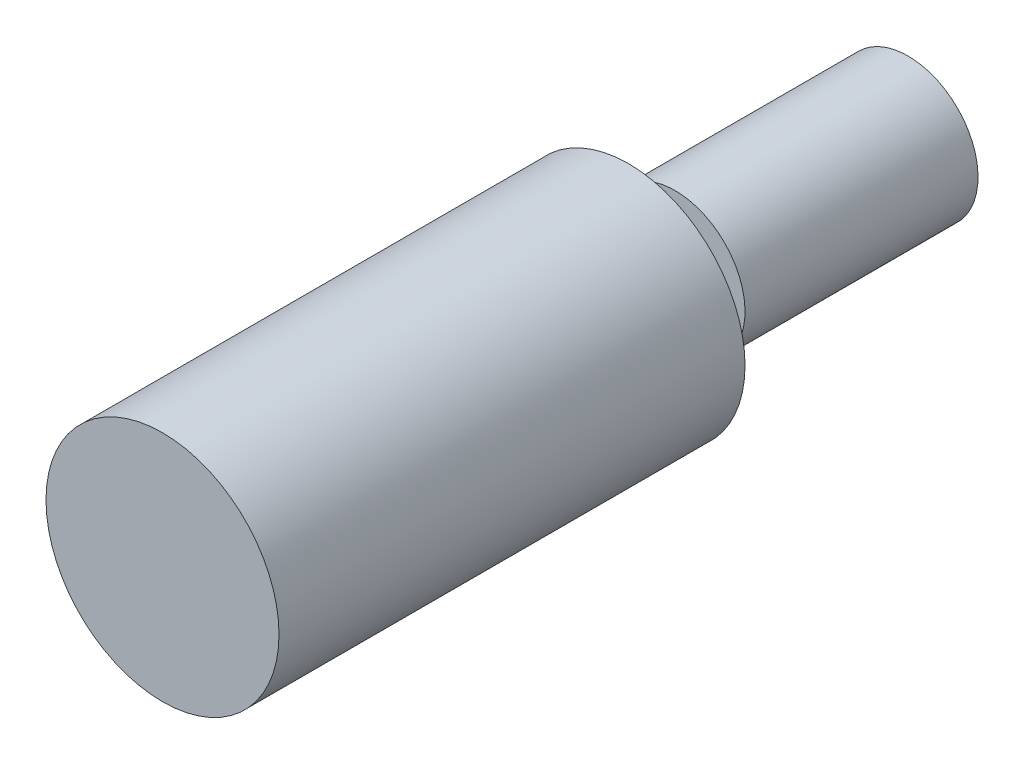
ISO-10303-21;
HEADER;
FILE_DESCRIPTION(('STEP AP214'),'2;1');
FILE_NAME('part.step','',(''),(''),'','','');
FILE_SCHEMA(('AUTOMOTIVE_DESIGN { 1 0 10303 214 1 1 1 1 }'));
ENDSEC;
DATA;
#1=APPLICATION_CONTEXT('core data for automotive mechanical design processes');
#2=APPLICATION_PROTOCOL_DEFINITION('international standard','automotive_design',2000,#1);
#3=PRODUCT_CONTEXT('',#1,'mechanical');
#4=PRODUCT('Part','Part','',(#3));
#5=PRODUCT_RELATED_PRODUCT_CATEGORY('part','',(#4));
#6=PRODUCT_DEFINITION_FORMATION('','',#4);
#7=PRODUCT_DEFINITION_CONTEXT('part definition',#1,'design');
#8=PRODUCT_DEFINITION('design','',#6,#7);
#9=PRODUCT_DEFINITION_SHAPE('','',#8);
#10=(LENGTH_UNIT() NAMED_UNIT(*) SI_UNIT(.MILLI.,.METRE.));
#11=(NAMED_UNIT(*) PLANE_ANGLE_UNIT() SI_UNIT($,.RADIAN.));
#12=(NAMED_UNIT(*) SI_UNIT($,.STERADIAN.) SOLID_ANGLE_UNIT());
#13=UNCERTAINTY_MEASURE_WITH_UNIT(LENGTH_MEASURE(1.E-05),#10,'distance_accuracy_value','');
#14=(GEOMETRIC_REPRESENTATION_CONTEXT(3) GLOBAL_UNCERTAINTY_ASSIGNED_CONTEXT((#13)) GLOBAL_UNIT_ASSIGNED_CONTEXT((#10,
#11,#12)) REPRESENTATION_CONTEXT('',''));
#15=CARTESIAN_POINT('',(0.,0.,0.));
#16=DIRECTION('',(0.,0.,1.));
#17=DIRECTION('',(1.,0.,0.));
#18=AXIS2_PLACEMENT_3D('',#15,#16,#17);
#19=CARTESIAN_POINT('',(0.,0.,-6.));
#20=DIRECTION('',(0.,0.,1.));
#21=DIRECTION('',(0.,-1.,0.));
#22=AXIS2_PLACEMENT_3D('',#19,#20,#21);
#23=PLANE('',#22);
#24=CARTESIAN_POINT('',(0.,0.,-6.));
#25=DIRECTION('',(0.,0.,1.));
#26=DIRECTION('',(0.,-1.,0.));
#27=AXIS2_PLACEMENT_3D('',#24,#25,#26);
#28=CIRCLE('',#27,1.50000000000001);
#29=CARTESIAN_POINT('',(0.,-1.50000000000005,-5.99999999999999));
#30=VERTEX_POINT('',#29);
#31=EDGE_CURVE('E10',#30,#30,#28,.T.);
#32=ORIENTED_EDGE('',*,*,#31,.F.);
#33=EDGE_LOOP('',(#32));
#34=FACE_BOUND('',#33,.T.);
#35=ADVANCED_FACE('F35',(#34),#23,.F.);
#36=CARTESIAN_POINT('',(0.,3.02086212207189E-13,44.6812413574794));
#37=DIRECTION('',(0.,0.,1.));
#38=DIRECTION('',(0.,-1.,0.));
#39=AXIS2_PLACEMENT_3D('',#36,#37,#38);
#40=CYLINDRICAL_SURFACE('',#39,1.5);
#41=CARTESIAN_POINT('',(0.,0.,-1.));
#42=DIRECTION('',(0.,0.,1.));
#43=DIRECTION('',(0.,-1.,0.));
#44=AXIS2_PLACEMENT_3D('',#41,#42,#43);
#45=CIRCLE('',#44,1.5);
#46=CARTESIAN_POINT('',(0.,-1.50000000000001,-0.999999999999991));
#47=VERTEX_POINT('',#46);
#48=EDGE_CURVE('E41',#47,#47,#45,.T.);
#49=ORIENTED_EDGE('',*,*,#48,.F.);
#50=EDGE_LOOP('',(#49));
#51=FACE_BOUND('',#50,.T.);
#52=ORIENTED_EDGE('',*,*,#31,.T.);
#53=EDGE_LOOP('',(#52));
#54=FACE_BOUND('',#53,.T.);
#55=ADVANCED_FACE('F83',(#51,#54),#40,.T.);
#56=CARTESIAN_POINT('',(1.5,0.,-1.));
#57=DIRECTION('',(0.,0.,-1.));
#58=DIRECTION('',(0.,1.,0.));
#59=AXIS2_PLACEMENT_3D('',#56,#57,#58);
#60=PLANE('',#59);
#61=CARTESIAN_POINT('',(0.,0.,-1.));
#62=DIRECTION('',(0.,0.,1.));
#63=DIRECTION('',(0.,-1.,0.));
#64=AXIS2_PLACEMENT_3D('',#61,#62,#63);
#65=CIRCLE('',#64,1.);
#66=CARTESIAN_POINT('',(0.,-1.00000000000001,-0.999999999999994));
#67=VERTEX_POINT('',#66);
#68=EDGE_CURVE('E45',#67,#67,#65,.T.);
#69=ORIENTED_EDGE('',*,*,#68,.F.);
#70=EDGE_LOOP('',(#69));
#71=FACE_BOUND('',#70,.T.);
#72=ORIENTED_EDGE('',*,*,#48,.T.);
#73=EDGE_LOOP('',(#72));
#74=FACE_BOUND('',#73,.T.);
#75=ADVANCED_FACE('F78',(#71,#74),#60,.F.);
#76=CARTESIAN_POINT('',(0.,3.02086212207189E-13,44.6812413574794));
#77=DIRECTION('',(0.,0.,1.));
#78=DIRECTION('',(0.,-1.,0.));
#79=AXIS2_PLACEMENT_3D('',#76,#77,#78);
#80=CYLINDRICAL_SURFACE('',#79,1.);
#81=CARTESIAN_POINT('',(0.,0.,0.));
#82=DIRECTION('',(0.,0.,1.));
#83=DIRECTION('',(0.,-1.,0.));
#84=AXIS2_PLACEMENT_3D('',#81,#82,#83);
#85=CIRCLE('',#84,1.);
#86=CARTESIAN_POINT('',(0.,-1.,0.));
#87=VERTEX_POINT('',#86);
#88=EDGE_CURVE('E49',#87,#87,#85,.T.);
#89=ORIENTED_EDGE('',*,*,#88,.F.);
#90=EDGE_LOOP('',(#89));
#91=FACE_BOUND('',#90,.T.);
#92=ORIENTED_EDGE('',*,*,#68,.T.);
#93=EDGE_LOOP('',(#92));
#94=FACE_BOUND('',#93,.T.);
#95=ADVANCED_FACE('F72',(#91,#94),#80,.T.);
#96=CARTESIAN_POINT('',(2.50000000000002,0.,0.));
#97=DIRECTION('',(0.,0.,1.));
#98=DIRECTION('',(0.,-1.,0.));
#99=AXIS2_PLACEMENT_3D('',#96,#97,#98);
#100=PLANE('',#99);
#101=CARTESIAN_POINT('',(0.,0.,0.));
#102=DIRECTION('',(0.,0.,1.));
#103=DIRECTION('',(0.,-1.,0.));
#104=AXIS2_PLACEMENT_3D('',#101,#102,#103);
#105=CIRCLE('',#104,2.50000000000001);
#106=CARTESIAN_POINT('',(0.,-2.50000000000001,0.));
#107=VERTEX_POINT('',#106);
#108=EDGE_CURVE('E54',#107,#107,#105,.T.);
#109=ORIENTED_EDGE('',*,*,#108,.F.);
#110=EDGE_LOOP('',(#109));
#111=FACE_BOUND('',#110,.T.);
#112=ORIENTED_EDGE('',*,*,#88,.T.);
#113=EDGE_LOOP('',(#112));
#114=FACE_BOUND('',#113,.T.);
#115=ADVANCED_FACE('F66',(#111,#114),#100,.F.);
#116=CARTESIAN_POINT('',(0.,3.02086212207189E-13,44.6812413574794));
#117=DIRECTION('',(0.,0.,1.));
#118=DIRECTION('',(0.,-1.,0.));
#119=AXIS2_PLACEMENT_3D('',#116,#117,#118);
#120=CYLINDRICAL_SURFACE('',#119,2.50000000000001);
#121=CARTESIAN_POINT('',(0.,0.,10.));
#122=DIRECTION('',(0.,0.,1.));
#123=DIRECTION('',(0.,-1.,0.));
#124=AXIS2_PLACEMENT_3D('',#121,#122,#123);
#125=CIRCLE('',#124,2.5);
#126=CARTESIAN_POINT('',(0.,-2.49999999999994,10.));
#127=VERTEX_POINT('',#126);
#128=EDGE_CURVE('E57',#127,#127,#125,.T.);
#129=ORIENTED_EDGE('',*,*,#128,.F.);
#130=EDGE_LOOP('',(#129));
#131=FACE_BOUND('',#130,.T.);
#132=ORIENTED_EDGE('',*,*,#108,.T.);
#133=EDGE_LOOP('',(#132));
#134=FACE_BOUND('',#133,.T.);
#135=ADVANCED_FACE('F63',(#131,#134),#120,.T.);
#136=CARTESIAN_POINT('',(0.,0.,10.));
#137=DIRECTION('',(0.,0.,-1.));
#138=DIRECTION('',(0.,1.,0.));
#139=AXIS2_PLACEMENT_3D('',#136,#137,#138);
#140=PLANE('',#139);
#141=ORIENTED_EDGE('',*,*,#128,.T.);
#142=EDGE_LOOP('',(#141));
#143=FACE_BOUND('',#142,.T.);
#144=ADVANCED_FACE('F61',(#143),#140,.F.);
#145=CLOSED_SHELL('',(#35,#55,#75,#95,#115,#135,#144));
#146=MANIFOLD_SOLID_BREP('B2',#145);
#147=ADVANCED_BREP_SHAPE_REPRESENTATION('',(#18,#146),#14);
#148=SHAPE_DEFINITION_REPRESENTATION(#9,#147);
ENDSEC;
END-ISO-10303-21;
